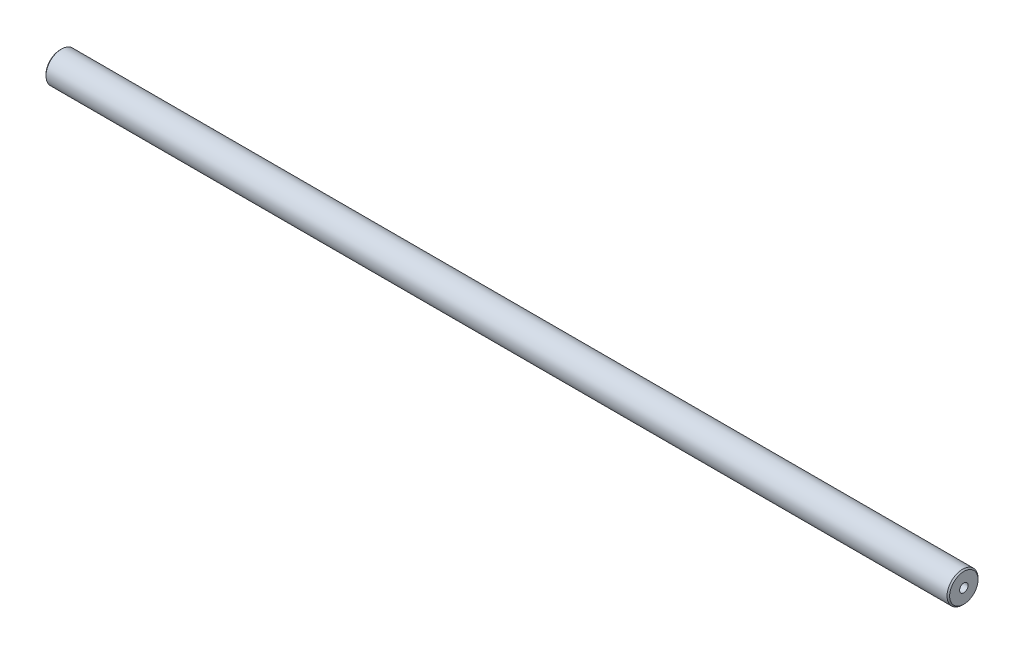
ISO-10303-21;
HEADER;
FILE_DESCRIPTION(('STEP AP214'),'2;1');
FILE_NAME('part.step','',(''),(''),'','','');
FILE_SCHEMA(('AUTOMOTIVE_DESIGN { 1 0 10303 214 1 1 1 1 }'));
ENDSEC;
DATA;
#1=APPLICATION_CONTEXT('core data for automotive mechanical design processes');
#2=APPLICATION_PROTOCOL_DEFINITION('international standard','automotive_design',2000,#1);
#3=PRODUCT_CONTEXT('',#1,'mechanical');
#4=PRODUCT('Part','Part','',(#3));
#5=PRODUCT_RELATED_PRODUCT_CATEGORY('part','',(#4));
#6=PRODUCT_DEFINITION_FORMATION('','',#4);
#7=PRODUCT_DEFINITION_CONTEXT('part definition',#1,'design');
#8=PRODUCT_DEFINITION('design','',#6,#7);
#9=PRODUCT_DEFINITION_SHAPE('','',#8);
#10=(LENGTH_UNIT() NAMED_UNIT(*) SI_UNIT(.MILLI.,.METRE.));
#11=(NAMED_UNIT(*) PLANE_ANGLE_UNIT() SI_UNIT($,.RADIAN.));
#12=(NAMED_UNIT(*) SI_UNIT($,.STERADIAN.) SOLID_ANGLE_UNIT());
#13=UNCERTAINTY_MEASURE_WITH_UNIT(LENGTH_MEASURE(1.E-05),#10,'distance_accuracy_value','');
#14=(GEOMETRIC_REPRESENTATION_CONTEXT(3) GLOBAL_UNCERTAINTY_ASSIGNED_CONTEXT((#13)) GLOBAL_UNIT_ASSIGNED_CONTEXT((#10,
#11,#12)) REPRESENTATION_CONTEXT('',''));
#15=CARTESIAN_POINT('',(0.,0.,0.));
#16=DIRECTION('',(0.,0.,1.));
#17=DIRECTION('',(1.,0.,0.));
#18=AXIS2_PLACEMENT_3D('',#15,#16,#17);
#19=CARTESIAN_POINT('',(0.,0.,0.));
#20=DIRECTION('',(1.,0.,0.));
#21=DIRECTION('',(0.,0.,-1.));
#22=AXIS2_PLACEMENT_3D('',#19,#20,#21);
#23=PLANE('',#22);
#24=CARTESIAN_POINT('',(0.,0.,0.));
#25=DIRECTION('',(1.,0.,0.));
#26=DIRECTION('',(0.,0.,-1.));
#27=AXIS2_PLACEMENT_3D('',#24,#25,#26);
#28=CIRCLE('',#27,5.49999999999998);
#29=CARTESIAN_POINT('',(0.,0.,-5.49999999999998));
#30=VERTEX_POINT('',#29);
#31=EDGE_CURVE('E72',#30,#30,#28,.F.);
#32=ORIENTED_EDGE('',*,*,#31,.T.);
#33=EDGE_LOOP('',(#32));
#34=FACE_BOUND('',#33,.T.);
#35=CARTESIAN_POINT('',(0.,0.,0.));
#36=DIRECTION('',(-1.,0.,0.));
#37=DIRECTION('',(0.,0.,1.));
#38=AXIS2_PLACEMENT_3D('',#35,#36,#37);
#39=CIRCLE('',#38,1.65);
#40=CARTESIAN_POINT('',(0.,0.,1.65));
#41=VERTEX_POINT('',#40);
#42=EDGE_CURVE('E61',#41,#41,#39,.T.);
#43=ORIENTED_EDGE('',*,*,#42,.F.);
#44=EDGE_LOOP('',(#43));
#45=FACE_BOUND('',#44,.T.);
#46=ADVANCED_FACE('F37',(#34,#45),#23,.F.);
#47=CARTESIAN_POINT('',(0.,0.,0.));
#48=DIRECTION('',(-1.,0.,0.));
#49=DIRECTION('',(0.,0.,1.));
#50=AXIS2_PLACEMENT_3D('',#47,#48,#49);
#51=CYLINDRICAL_SURFACE('',#50,6.);
#52=CARTESIAN_POINT('',(0.500000000000017,0.,0.));
#53=DIRECTION('',(1.,0.,0.));
#54=DIRECTION('',(0.,0.,-1.));
#55=AXIS2_PLACEMENT_3D('',#52,#53,#54);
#56=CIRCLE('',#55,6.);
#57=CARTESIAN_POINT('',(0.500000000000017,0.,-6.));
#58=VERTEX_POINT('',#57);
#59=EDGE_CURVE('E45',#58,#58,#56,.T.);
#60=ORIENTED_EDGE('',*,*,#59,.T.);
#61=EDGE_LOOP('',(#60));
#62=FACE_BOUND('',#61,.T.);
#63=CARTESIAN_POINT('',(349.5,0.,0.));
#64=DIRECTION('',(-1.,0.,0.));
#65=DIRECTION('',(0.,0.,1.));
#66=AXIS2_PLACEMENT_3D('',#63,#64,#65);
#67=CIRCLE('',#66,6.);
#68=CARTESIAN_POINT('',(349.5,0.,6.));
#69=VERTEX_POINT('',#68);
#70=EDGE_CURVE('E75',#69,#69,#67,.T.);
#71=ORIENTED_EDGE('',*,*,#70,.T.);
#72=EDGE_LOOP('',(#71));
#73=FACE_BOUND('',#72,.T.);
#74=ADVANCED_FACE('F80',(#62,#73),#51,.T.);
#75=CARTESIAN_POINT('',(350.,0.,0.));
#76=DIRECTION('',(-1.,0.,0.));
#77=DIRECTION('',(0.,0.,1.));
#78=AXIS2_PLACEMENT_3D('',#75,#76,#77);
#79=PLANE('',#78);
#80=CARTESIAN_POINT('',(350.,0.,0.));
#81=DIRECTION('',(-1.,0.,0.));
#82=DIRECTION('',(0.,0.,1.));
#83=AXIS2_PLACEMENT_3D('',#80,#81,#82);
#84=CIRCLE('',#83,5.5);
#85=CARTESIAN_POINT('',(350.,0.,5.5));
#86=VERTEX_POINT('',#85);
#87=EDGE_CURVE('E11',#86,#86,#84,.F.);
#88=ORIENTED_EDGE('',*,*,#87,.T.);
#89=EDGE_LOOP('',(#88));
#90=FACE_BOUND('',#89,.T.);
#91=CARTESIAN_POINT('',(350.,0.,0.));
#92=DIRECTION('',(1.,0.,0.));
#93=DIRECTION('',(0.,0.,-1.));
#94=AXIS2_PLACEMENT_3D('',#91,#92,#93);
#95=CIRCLE('',#94,1.65);
#96=CARTESIAN_POINT('',(350.,0.,-1.65));
#97=VERTEX_POINT('',#96);
#98=EDGE_CURVE('E62',#97,#97,#95,.T.);
#99=ORIENTED_EDGE('',*,*,#98,.F.);
#100=EDGE_LOOP('',(#99));
#101=FACE_BOUND('',#100,.T.);
#102=ADVANCED_FACE('F100',(#90,#101),#79,.F.);
#103=CARTESIAN_POINT('',(11.5,0.,0.));
#104=DIRECTION('',(-1.,0.,0.));
#105=DIRECTION('',(0.,0.,1.));
#106=AXIS2_PLACEMENT_3D('',#103,#104,#105);
#107=CONICAL_SURFACE('',#106,1.65,1.02974425867665);
#108=CARTESIAN_POINT('',(12.4914200213955,0.,0.));
#109=VERTEX_POINT('',#108);
#110=VERTEX_LOOP('',#109);
#111=FACE_BOUND('',#110,.T.);
#112=CARTESIAN_POINT('',(11.5,0.,0.));
#113=DIRECTION('',(-1.,0.,0.));
#114=DIRECTION('',(0.,0.,1.));
#115=AXIS2_PLACEMENT_3D('',#112,#113,#114);
#116=CIRCLE('',#115,1.65);
#117=CARTESIAN_POINT('',(11.5,0.,1.65));
#118=VERTEX_POINT('',#117);
#119=EDGE_CURVE('E65',#118,#118,#116,.T.);
#120=ORIENTED_EDGE('',*,*,#119,.T.);
#121=EDGE_LOOP('',(#120));
#122=FACE_BOUND('',#121,.T.);
#123=ADVANCED_FACE('F94',(#111,#122),#107,.F.);
#124=CARTESIAN_POINT('',(0.,0.,0.));
#125=DIRECTION('',(-1.,0.,0.));
#126=DIRECTION('',(0.,0.,1.));
#127=AXIS2_PLACEMENT_3D('',#124,#125,#126);
#128=CYLINDRICAL_SURFACE('',#127,1.65);
#129=ORIENTED_EDGE('',*,*,#119,.F.);
#130=EDGE_LOOP('',(#129));
#131=FACE_BOUND('',#130,.T.);
#132=ORIENTED_EDGE('',*,*,#42,.T.);
#133=EDGE_LOOP('',(#132));
#134=FACE_BOUND('',#133,.T.);
#135=ADVANCED_FACE('F55',(#131,#134),#128,.F.);
#136=CARTESIAN_POINT('',(338.5,0.,0.));
#137=DIRECTION('',(1.,0.,0.));
#138=DIRECTION('',(0.,0.,-1.));
#139=AXIS2_PLACEMENT_3D('',#136,#137,#138);
#140=CONICAL_SURFACE('',#139,1.65,1.02974425867666);
#141=CARTESIAN_POINT('',(337.508579978605,0.,0.));
#142=VERTEX_POINT('',#141);
#143=VERTEX_LOOP('',#142);
#144=FACE_BOUND('',#143,.T.);
#145=CARTESIAN_POINT('',(338.5,0.,0.));
#146=DIRECTION('',(1.,0.,0.));
#147=DIRECTION('',(0.,0.,-1.));
#148=AXIS2_PLACEMENT_3D('',#145,#146,#147);
#149=CIRCLE('',#148,1.65);
#150=CARTESIAN_POINT('',(338.5,0.,-1.65));
#151=VERTEX_POINT('',#150);
#152=EDGE_CURVE('E59',#151,#151,#149,.T.);
#153=ORIENTED_EDGE('',*,*,#152,.T.);
#154=EDGE_LOOP('',(#153));
#155=FACE_BOUND('',#154,.T.);
#156=ADVANCED_FACE('F51',(#144,#155),#140,.F.);
#157=CARTESIAN_POINT('',(350.,0.,0.));
#158=DIRECTION('',(1.,0.,0.));
#159=DIRECTION('',(0.,0.,-1.));
#160=AXIS2_PLACEMENT_3D('',#157,#158,#159);
#161=CYLINDRICAL_SURFACE('',#160,1.65);
#162=ORIENTED_EDGE('',*,*,#152,.F.);
#163=EDGE_LOOP('',(#162));
#164=FACE_BOUND('',#163,.T.);
#165=ORIENTED_EDGE('',*,*,#98,.T.);
#166=EDGE_LOOP('',(#165));
#167=FACE_BOUND('',#166,.T.);
#168=ADVANCED_FACE('F54',(#164,#167),#161,.F.);
#169=CARTESIAN_POINT('',(0.,0.,0.));
#170=DIRECTION('',(1.,0.,0.));
#171=DIRECTION('',(0.,0.,-1.));
#172=AXIS2_PLACEMENT_3D('',#169,#170,#171);
#173=CONICAL_SURFACE('',#172,5.49999999999998,0.785398163397455);
#174=ORIENTED_EDGE('',*,*,#59,.F.);
#175=EDGE_LOOP('',(#174));
#176=FACE_BOUND('',#175,.T.);
#177=ORIENTED_EDGE('',*,*,#31,.F.);
#178=EDGE_LOOP('',(#177));
#179=FACE_BOUND('',#178,.T.);
#180=ADVANCED_FACE('F83',(#176,#179),#173,.T.);
#181=CARTESIAN_POINT('',(349.5,0.,0.));
#182=DIRECTION('',(-1.,0.,0.));
#183=DIRECTION('',(0.,0.,1.));
#184=AXIS2_PLACEMENT_3D('',#181,#182,#183);
#185=CONICAL_SURFACE('',#184,6.,0.785398163397499);
#186=ORIENTED_EDGE('',*,*,#87,.F.);
#187=EDGE_LOOP('',(#186));
#188=FACE_BOUND('',#187,.T.);
#189=ORIENTED_EDGE('',*,*,#70,.F.);
#190=EDGE_LOOP('',(#189));
#191=FACE_BOUND('',#190,.T.);
#192=ADVANCED_FACE('F39',(#188,#191),#185,.T.);
#193=CLOSED_SHELL('',(#46,#74,#102,#123,#135,#156,#168,#180,#192));
#194=MANIFOLD_SOLID_BREP('B2',#193);
#195=ADVANCED_BREP_SHAPE_REPRESENTATION('',(#18,#194),#14);
#196=SHAPE_DEFINITION_REPRESENTATION(#9,#195);
ENDSEC;
END-ISO-10303-21;
